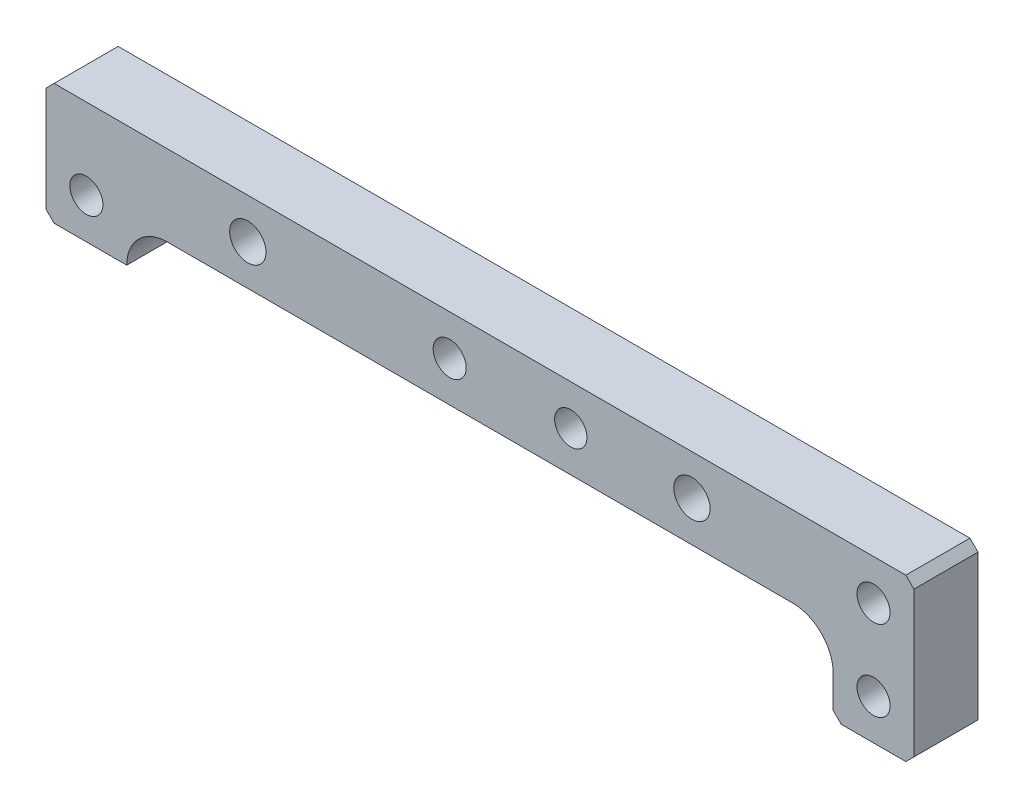
ISO-10303-21;
HEADER;
FILE_DESCRIPTION(('STEP AP214'),'2;1');
FILE_NAME('part.step','',(''),(''),'','','');
FILE_SCHEMA(('AUTOMOTIVE_DESIGN { 1 0 10303 214 1 1 1 1 }'));
ENDSEC;
DATA;
#1=APPLICATION_CONTEXT('core data for automotive mechanical design processes');
#2=APPLICATION_PROTOCOL_DEFINITION('international standard','automotive_design',2000,#1);
#3=PRODUCT_CONTEXT('',#1,'mechanical');
#4=PRODUCT('Part','Part','',(#3));
#5=PRODUCT_RELATED_PRODUCT_CATEGORY('part','',(#4));
#6=PRODUCT_DEFINITION_FORMATION('','',#4);
#7=PRODUCT_DEFINITION_CONTEXT('part definition',#1,'design');
#8=PRODUCT_DEFINITION('design','',#6,#7);
#9=PRODUCT_DEFINITION_SHAPE('','',#8);
#10=(LENGTH_UNIT() NAMED_UNIT(*) SI_UNIT(.MILLI.,.METRE.));
#11=(NAMED_UNIT(*) PLANE_ANGLE_UNIT() SI_UNIT($,.RADIAN.));
#12=(NAMED_UNIT(*) SI_UNIT($,.STERADIAN.) SOLID_ANGLE_UNIT());
#13=UNCERTAINTY_MEASURE_WITH_UNIT(LENGTH_MEASURE(1.E-05),#10,'distance_accuracy_value','');
#14=(GEOMETRIC_REPRESENTATION_CONTEXT(3) GLOBAL_UNCERTAINTY_ASSIGNED_CONTEXT((#13)) GLOBAL_UNIT_ASSIGNED_CONTEXT((#10,
#11,#12)) REPRESENTATION_CONTEXT('',''));
#15=CARTESIAN_POINT('',(0.,0.,0.));
#16=DIRECTION('',(0.,0.,1.));
#17=DIRECTION('',(1.,0.,0.));
#18=AXIS2_PLACEMENT_3D('',#15,#16,#17);
#19=CARTESIAN_POINT('',(0.,0.,15.875));
#20=DIRECTION('',(0.,0.,-1.));
#21=DIRECTION('',(-1.,0.,0.));
#22=AXIS2_PLACEMENT_3D('',#19,#20,#21);
#23=PLANE('',#22);
#24=CARTESIAN_POINT('',(-80.,0.,15.875));
#25=DIRECTION('',(0.,0.,-1.));
#26=DIRECTION('',(-1.,0.,0.));
#27=AXIS2_PLACEMENT_3D('',#24,#25,#26);
#28=CIRCLE('',#27,4.5);
#29=CARTESIAN_POINT('',(-84.5,0.,15.875));
#30=VERTEX_POINT('',#29);
#31=EDGE_CURVE('E375',#30,#30,#28,.T.);
#32=ORIENTED_EDGE('',*,*,#31,.T.);
#33=EDGE_LOOP('',(#32));
#34=FACE_BOUND('',#33,.T.);
#35=CARTESIAN_POINT('',(30.,0.,15.875));
#36=DIRECTION('',(0.,0.,-1.));
#37=DIRECTION('',(-1.,0.,0.));
#38=AXIS2_PLACEMENT_3D('',#35,#36,#37);
#39=CIRCLE('',#38,4.5);
#40=CARTESIAN_POINT('',(25.5,0.,15.875));
#41=VERTEX_POINT('',#40);
#42=EDGE_CURVE('E367',#41,#41,#39,.T.);
#43=ORIENTED_EDGE('',*,*,#42,.T.);
#44=EDGE_LOOP('',(#43));
#45=FACE_BOUND('',#44,.T.);
#46=DIRECTION('',(-1.,0.,0.));
#47=VECTOR('',#46,1.);
#48=CARTESIAN_POINT('',(0.,10.,15.875));
#49=LINE('',#48,#47);
#50=CARTESIAN_POINT('',(82.9999999999999,10.,15.875));
#51=VERTEX_POINT('',#50);
#52=CARTESIAN_POINT('',(-128.,9.99999999999994,15.875));
#53=VERTEX_POINT('',#52);
#54=EDGE_CURVE('E166',#51,#53,#49,.T.);
#55=ORIENTED_EDGE('',*,*,#54,.T.);
#56=DIRECTION('',(0.707106781186552,0.707106781186543,0.));
#57=VECTOR('',#56,1.);
#58=CARTESIAN_POINT('',(-130.,8.,15.875));
#59=LINE('',#58,#57);
#60=CARTESIAN_POINT('',(-130.,8.,15.875));
#61=VERTEX_POINT('',#60);
#62=EDGE_CURVE('E204',#53,#61,#59,.F.);
#63=ORIENTED_EDGE('',*,*,#62,.T.);
#64=DIRECTION('',(0.,-1.,0.));
#65=VECTOR('',#64,1.);
#66=CARTESIAN_POINT('',(-130.,10.,15.875));
#67=LINE('',#66,#65);
#68=CARTESIAN_POINT('',(-130.,-18.,15.875));
#69=VERTEX_POINT('',#68);
#70=EDGE_CURVE('E156',#61,#69,#67,.T.);
#71=ORIENTED_EDGE('',*,*,#70,.T.);
#72=DIRECTION('',(-0.707106781186552,0.707106781186543,0.));
#73=VECTOR('',#72,1.);
#74=CARTESIAN_POINT('',(-128.,-20.,15.875));
#75=LINE('',#74,#73);
#76=CARTESIAN_POINT('',(-128.,-20.,15.875));
#77=VERTEX_POINT('',#76);
#78=EDGE_CURVE('E151',#69,#77,#75,.F.);
#79=ORIENTED_EDGE('',*,*,#78,.T.);
#80=DIRECTION('',(1.,0.,0.));
#81=VECTOR('',#80,1.);
#82=CARTESIAN_POINT('',(-110.,-20.,15.875));
#83=LINE('',#82,#81);
#84=CARTESIAN_POINT('',(-110.,-20.,15.875));
#85=VERTEX_POINT('',#84);
#86=EDGE_CURVE('E141',#77,#85,#83,.T.);
#87=ORIENTED_EDGE('',*,*,#86,.T.);
#88=CARTESIAN_POINT('',(-100.,-20.,15.875));
#89=DIRECTION('',(0.,0.,-1.));
#90=DIRECTION('',(-1.,0.,0.));
#91=AXIS2_PLACEMENT_3D('',#88,#89,#90);
#92=CIRCLE('',#91,10.);
#93=CARTESIAN_POINT('',(-100.,-10.,15.875));
#94=VERTEX_POINT('',#93);
#95=EDGE_CURVE('E147',#85,#94,#92,.T.);
#96=ORIENTED_EDGE('',*,*,#95,.T.);
#97=DIRECTION('',(1.,0.,0.));
#98=VECTOR('',#97,1.);
#99=CARTESIAN_POINT('',(0.,-10.,15.875));
#100=LINE('',#99,#98);
#101=CARTESIAN_POINT('',(55.,-10.,15.875));
#102=VERTEX_POINT('',#101);
#103=EDGE_CURVE('E155',#94,#102,#100,.T.);
#104=ORIENTED_EDGE('',*,*,#103,.T.);
#105=CARTESIAN_POINT('',(55.,-20.,15.875));
#106=DIRECTION('',(0.,0.,-1.));
#107=DIRECTION('',(-1.,0.,0.));
#108=AXIS2_PLACEMENT_3D('',#105,#106,#107);
#109=CIRCLE('',#108,10.);
#110=CARTESIAN_POINT('',(65.,-20.,15.875));
#111=VERTEX_POINT('',#110);
#112=EDGE_CURVE('E177',#102,#111,#109,.T.);
#113=ORIENTED_EDGE('',*,*,#112,.T.);
#114=DIRECTION('',(0.,-1.,0.));
#115=VECTOR('',#114,1.);
#116=CARTESIAN_POINT('',(65.,-30.,15.875));
#117=LINE('',#116,#115);
#118=CARTESIAN_POINT('',(65.,-28.,15.875));
#119=VERTEX_POINT('',#118);
#120=EDGE_CURVE('E221',#111,#119,#117,.T.);
#121=ORIENTED_EDGE('',*,*,#120,.T.);
#122=DIRECTION('',(-0.707106781186543,0.707106781186552,0.));
#123=VECTOR('',#122,1.);
#124=CARTESIAN_POINT('',(66.9999999999999,-30.,15.875));
#125=LINE('',#124,#123);
#126=CARTESIAN_POINT('',(66.9999999999999,-30.,15.875));
#127=VERTEX_POINT('',#126);
#128=EDGE_CURVE('E201',#119,#127,#125,.F.);
#129=ORIENTED_EDGE('',*,*,#128,.T.);
#130=DIRECTION('',(1.,0.,0.));
#131=VECTOR('',#130,1.);
#132=CARTESIAN_POINT('',(85.,-30.,15.875));
#133=LINE('',#132,#131);
#134=CARTESIAN_POINT('',(83.,-30.,15.875));
#135=VERTEX_POINT('',#134);
#136=EDGE_CURVE('E229',#127,#135,#133,.T.);
#137=ORIENTED_EDGE('',*,*,#136,.T.);
#138=DIRECTION('',(-0.707106781186552,-0.707106781186543,0.));
#139=VECTOR('',#138,1.);
#140=CARTESIAN_POINT('',(85.,-28.,15.875));
#141=LINE('',#140,#139);
#142=CARTESIAN_POINT('',(85.,-28.,15.875));
#143=VERTEX_POINT('',#142);
#144=EDGE_CURVE('E62',#135,#143,#141,.F.);
#145=ORIENTED_EDGE('',*,*,#144,.T.);
#146=DIRECTION('',(0.,1.,0.));
#147=VECTOR('',#146,1.);
#148=CARTESIAN_POINT('',(85.,10.,15.875));
#149=LINE('',#148,#147);
#150=CARTESIAN_POINT('',(85.,8.,15.875));
#151=VERTEX_POINT('',#150);
#152=EDGE_CURVE('E327',#143,#151,#149,.T.);
#153=ORIENTED_EDGE('',*,*,#152,.T.);
#154=DIRECTION('',(0.707106781186548,-0.707106781186548,0.));
#155=VECTOR('',#154,1.);
#156=CARTESIAN_POINT('',(82.9999999999999,10.,15.875));
#157=LINE('',#156,#155);
#158=EDGE_CURVE('E198',#151,#51,#157,.F.);
#159=ORIENTED_EDGE('',*,*,#158,.T.);
#160=EDGE_LOOP('',(#55,#63,#71,#79,#87,#96,#104,#113,#121,#129,#137,#145,#153,#159));
#161=FACE_BOUND('',#160,.T.);
#162=CARTESIAN_POINT('',(0.,0.,15.875));
#163=DIRECTION('',(0.,0.,1.));
#164=DIRECTION('',(1.,0.,0.));
#165=AXIS2_PLACEMENT_3D('',#162,#163,#164);
#166=CIRCLE('',#165,4.);
#167=CARTESIAN_POINT('',(4.,0.,15.875));
#168=VERTEX_POINT('',#167);
#169=EDGE_CURVE('E336',#168,#168,#166,.T.);
#170=ORIENTED_EDGE('',*,*,#169,.F.);
#171=EDGE_LOOP('',(#170));
#172=FACE_BOUND('',#171,.T.);
#173=CARTESIAN_POINT('',(-30.,0.,15.875));
#174=DIRECTION('',(0.,0.,1.));
#175=DIRECTION('',(1.,0.,0.));
#176=AXIS2_PLACEMENT_3D('',#173,#174,#175);
#177=CIRCLE('',#176,4.1);
#178=CARTESIAN_POINT('',(-25.9,0.,15.875));
#179=VERTEX_POINT('',#178);
#180=EDGE_CURVE('E343',#179,#179,#177,.T.);
#181=ORIENTED_EDGE('',*,*,#180,.F.);
#182=EDGE_LOOP('',(#181));
#183=FACE_BOUND('',#182,.T.);
#184=CARTESIAN_POINT('',(-120.,-10.,15.875));
#185=DIRECTION('',(0.,0.,1.));
#186=DIRECTION('',(1.,0.,0.));
#187=AXIS2_PLACEMENT_3D('',#184,#185,#186);
#188=CIRCLE('',#187,4.09999999999999);
#189=CARTESIAN_POINT('',(-115.9,-10.,15.875));
#190=VERTEX_POINT('',#189);
#191=EDGE_CURVE('E349',#190,#190,#188,.T.);
#192=ORIENTED_EDGE('',*,*,#191,.F.);
#193=EDGE_LOOP('',(#192));
#194=FACE_BOUND('',#193,.T.);
#195=CARTESIAN_POINT('',(75.,0.,15.875));
#196=DIRECTION('',(0.,0.,1.));
#197=DIRECTION('',(1.,0.,0.));
#198=AXIS2_PLACEMENT_3D('',#195,#196,#197);
#199=CIRCLE('',#198,4.1);
#200=CARTESIAN_POINT('',(79.1,0.,15.875));
#201=VERTEX_POINT('',#200);
#202=EDGE_CURVE('E355',#201,#201,#199,.T.);
#203=ORIENTED_EDGE('',*,*,#202,.F.);
#204=EDGE_LOOP('',(#203));
#205=FACE_BOUND('',#204,.T.);
#206=CARTESIAN_POINT('',(75.,-20.,15.875));
#207=DIRECTION('',(0.,0.,1.));
#208=DIRECTION('',(1.,0.,0.));
#209=AXIS2_PLACEMENT_3D('',#206,#207,#208);
#210=CIRCLE('',#209,4.1);
#211=CARTESIAN_POINT('',(79.1,-20.,15.875));
#212=VERTEX_POINT('',#211);
#213=EDGE_CURVE('E361',#212,#212,#210,.T.);
#214=ORIENTED_EDGE('',*,*,#213,.F.);
#215=EDGE_LOOP('',(#214));
#216=FACE_BOUND('',#215,.T.);
#217=ADVANCED_FACE('F40',(#34,#45,#161,#172,#183,#194,#205,#216),#23,.F.);
#218=CARTESIAN_POINT('',(0.,0.,0.));
#219=DIRECTION('',(0.,0.,-1.));
#220=DIRECTION('',(-1.,0.,0.));
#221=AXIS2_PLACEMENT_3D('',#218,#219,#220);
#222=PLANE('',#221);
#223=CARTESIAN_POINT('',(-80.,0.,0.));
#224=DIRECTION('',(0.,0.,-1.));
#225=DIRECTION('',(-1.,0.,0.));
#226=AXIS2_PLACEMENT_3D('',#223,#224,#225);
#227=CIRCLE('',#226,4.5);
#228=CARTESIAN_POINT('',(-84.5,0.,0.));
#229=VERTEX_POINT('',#228);
#230=EDGE_CURVE('E377',#229,#229,#227,.T.);
#231=ORIENTED_EDGE('',*,*,#230,.F.);
#232=EDGE_LOOP('',(#231));
#233=FACE_BOUND('',#232,.T.);
#234=CARTESIAN_POINT('',(30.,0.,0.));
#235=DIRECTION('',(0.,0.,-1.));
#236=DIRECTION('',(-1.,0.,0.));
#237=AXIS2_PLACEMENT_3D('',#234,#235,#236);
#238=CIRCLE('',#237,4.5);
#239=CARTESIAN_POINT('',(25.5,0.,0.));
#240=VERTEX_POINT('',#239);
#241=EDGE_CURVE('E372',#240,#240,#238,.T.);
#242=ORIENTED_EDGE('',*,*,#241,.F.);
#243=EDGE_LOOP('',(#242));
#244=FACE_BOUND('',#243,.T.);
#245=CARTESIAN_POINT('',(75.,0.,0.));
#246=DIRECTION('',(0.,0.,1.));
#247=DIRECTION('',(1.,0.,0.));
#248=AXIS2_PLACEMENT_3D('',#245,#246,#247);
#249=CIRCLE('',#248,4.1);
#250=CARTESIAN_POINT('',(79.1,0.,0.));
#251=VERTEX_POINT('',#250);
#252=EDGE_CURVE('E358',#251,#251,#249,.T.);
#253=ORIENTED_EDGE('',*,*,#252,.T.);
#254=EDGE_LOOP('',(#253));
#255=FACE_BOUND('',#254,.T.);
#256=CARTESIAN_POINT('',(-30.,0.,0.));
#257=DIRECTION('',(0.,0.,1.));
#258=DIRECTION('',(1.,0.,0.));
#259=AXIS2_PLACEMENT_3D('',#256,#257,#258);
#260=CIRCLE('',#259,4.1);
#261=CARTESIAN_POINT('',(-25.9,0.,0.));
#262=VERTEX_POINT('',#261);
#263=EDGE_CURVE('E346',#262,#262,#260,.T.);
#264=ORIENTED_EDGE('',*,*,#263,.T.);
#265=EDGE_LOOP('',(#264));
#266=FACE_BOUND('',#265,.T.);
#267=DIRECTION('',(0.,-1.,0.));
#268=VECTOR('',#267,1.);
#269=CARTESIAN_POINT('',(-130.,10.,0.));
#270=LINE('',#269,#268);
#271=CARTESIAN_POINT('',(-130.,8.,0.));
#272=VERTEX_POINT('',#271);
#273=CARTESIAN_POINT('',(-130.,-18.,0.));
#274=VERTEX_POINT('',#273);
#275=EDGE_CURVE('E321',#272,#274,#270,.T.);
#276=ORIENTED_EDGE('',*,*,#275,.F.);
#277=DIRECTION('',(-0.707106781186552,-0.707106781186543,0.));
#278=VECTOR('',#277,1.);
#279=CARTESIAN_POINT('',(-68.9999999999991,69.0000000000001,0.));
#280=LINE('',#279,#278);
#281=CARTESIAN_POINT('',(-128.,10.,0.));
#282=VERTEX_POINT('',#281);
#283=EDGE_CURVE('E191',#272,#282,#280,.F.);
#284=ORIENTED_EDGE('',*,*,#283,.T.);
#285=DIRECTION('',(-1.,0.,0.));
#286=VECTOR('',#285,1.);
#287=CARTESIAN_POINT('',(0.,10.,0.));
#288=LINE('',#287,#286);
#289=CARTESIAN_POINT('',(82.9999999999999,10.,0.));
#290=VERTEX_POINT('',#289);
#291=EDGE_CURVE('E246',#290,#282,#288,.T.);
#292=ORIENTED_EDGE('',*,*,#291,.F.);
#293=DIRECTION('',(-0.707106781186548,0.707106781186548,0.));
#294=VECTOR('',#293,1.);
#295=CARTESIAN_POINT('',(46.5,46.5,0.));
#296=LINE('',#295,#294);
#297=CARTESIAN_POINT('',(85.,8.,0.));
#298=VERTEX_POINT('',#297);
#299=EDGE_CURVE('E183',#290,#298,#296,.F.);
#300=ORIENTED_EDGE('',*,*,#299,.T.);
#301=DIRECTION('',(0.,1.,0.));
#302=VECTOR('',#301,1.);
#303=CARTESIAN_POINT('',(85.,10.,0.));
#304=LINE('',#303,#302);
#305=CARTESIAN_POINT('',(85.,-28.,0.));
#306=VERTEX_POINT('',#305);
#307=EDGE_CURVE('E244',#306,#298,#304,.T.);
#308=ORIENTED_EDGE('',*,*,#307,.F.);
#309=DIRECTION('',(0.707106781186552,0.707106781186543,0.));
#310=VECTOR('',#309,1.);
#311=CARTESIAN_POINT('',(56.4999999999994,-56.5000000000002,0.));
#312=LINE('',#311,#310);
#313=CARTESIAN_POINT('',(83.,-30.,0.));
#314=VERTEX_POINT('',#313);
#315=EDGE_CURVE('E185',#306,#314,#312,.F.);
#316=ORIENTED_EDGE('',*,*,#315,.T.);
#317=DIRECTION('',(1.,0.,0.));
#318=VECTOR('',#317,1.);
#319=CARTESIAN_POINT('',(85.,-30.,0.));
#320=LINE('',#319,#318);
#321=CARTESIAN_POINT('',(66.9999999999999,-30.,0.));
#322=VERTEX_POINT('',#321);
#323=EDGE_CURVE('E237',#322,#314,#320,.T.);
#324=ORIENTED_EDGE('',*,*,#323,.F.);
#325=DIRECTION('',(0.707106781186543,-0.707106781186552,0.));
#326=VECTOR('',#325,1.);
#327=CARTESIAN_POINT('',(18.5000000000004,18.5000000000002,0.));
#328=LINE('',#327,#326);
#329=CARTESIAN_POINT('',(65.,-28.,0.));
#330=VERTEX_POINT('',#329);
#331=EDGE_CURVE('E187',#322,#330,#328,.F.);
#332=ORIENTED_EDGE('',*,*,#331,.T.);
#333=DIRECTION('',(0.,-1.,0.));
#334=VECTOR('',#333,1.);
#335=CARTESIAN_POINT('',(65.,-30.,0.));
#336=LINE('',#335,#334);
#337=CARTESIAN_POINT('',(65.,-20.,0.));
#338=VERTEX_POINT('',#337);
#339=EDGE_CURVE('E224',#338,#330,#336,.T.);
#340=ORIENTED_EDGE('',*,*,#339,.F.);
#341=CARTESIAN_POINT('',(55.,-20.,0.));
#342=DIRECTION('',(0.,0.,-1.));
#343=DIRECTION('',(-1.,0.,0.));
#344=AXIS2_PLACEMENT_3D('',#341,#342,#343);
#345=CIRCLE('',#344,10.);
#346=CARTESIAN_POINT('',(55.,-10.,0.));
#347=VERTEX_POINT('',#346);
#348=EDGE_CURVE('E258',#338,#347,#345,.F.);
#349=ORIENTED_EDGE('',*,*,#348,.T.);
#350=DIRECTION('',(1.,0.,0.));
#351=VECTOR('',#350,1.);
#352=CARTESIAN_POINT('',(65.,-10.,0.));
#353=LINE('',#352,#351);
#354=CARTESIAN_POINT('',(-100.,-9.99999999999999,0.));
#355=VERTEX_POINT('',#354);
#356=EDGE_CURVE('E248',#355,#347,#353,.T.);
#357=ORIENTED_EDGE('',*,*,#356,.F.);
#358=CARTESIAN_POINT('',(-100.,-20.,0.));
#359=DIRECTION('',(0.,0.,-1.));
#360=DIRECTION('',(-1.,0.,0.));
#361=AXIS2_PLACEMENT_3D('',#358,#359,#360);
#362=CIRCLE('',#361,10.);
#363=CARTESIAN_POINT('',(-110.,-20.,0.));
#364=VERTEX_POINT('',#363);
#365=EDGE_CURVE('E173',#355,#364,#362,.F.);
#366=ORIENTED_EDGE('',*,*,#365,.T.);
#367=DIRECTION('',(1.,0.,0.));
#368=VECTOR('',#367,1.);
#369=CARTESIAN_POINT('',(-110.,-20.,0.));
#370=LINE('',#369,#368);
#371=CARTESIAN_POINT('',(-128.,-20.,0.));
#372=VERTEX_POINT('',#371);
#373=EDGE_CURVE('E162',#372,#364,#370,.T.);
#374=ORIENTED_EDGE('',*,*,#373,.F.);
#375=DIRECTION('',(0.707106781186552,-0.707106781186543,0.));
#376=VECTOR('',#375,1.);
#377=CARTESIAN_POINT('',(-73.9999999999991,-74.0000000000001,0.));
#378=LINE('',#377,#376);
#379=EDGE_CURVE('E189',#372,#274,#378,.F.);
#380=ORIENTED_EDGE('',*,*,#379,.T.);
#381=EDGE_LOOP('',(#276,#284,#292,#300,#308,#316,#324,#332,#340,#349,#357,#366,#374,#380));
#382=FACE_BOUND('',#381,.T.);
#383=CARTESIAN_POINT('',(0.,0.,0.));
#384=DIRECTION('',(0.,0.,1.));
#385=DIRECTION('',(1.,0.,0.));
#386=AXIS2_PLACEMENT_3D('',#383,#384,#385);
#387=CIRCLE('',#386,4.);
#388=CARTESIAN_POINT('',(4.,0.,0.));
#389=VERTEX_POINT('',#388);
#390=EDGE_CURVE('E338',#389,#389,#387,.T.);
#391=ORIENTED_EDGE('',*,*,#390,.T.);
#392=EDGE_LOOP('',(#391));
#393=FACE_BOUND('',#392,.T.);
#394=CARTESIAN_POINT('',(-120.,-10.,0.));
#395=DIRECTION('',(0.,0.,1.));
#396=DIRECTION('',(1.,0.,0.));
#397=AXIS2_PLACEMENT_3D('',#394,#395,#396);
#398=CIRCLE('',#397,4.09999999999999);
#399=CARTESIAN_POINT('',(-115.9,-10.,0.));
#400=VERTEX_POINT('',#399);
#401=EDGE_CURVE('E352',#400,#400,#398,.T.);
#402=ORIENTED_EDGE('',*,*,#401,.T.);
#403=EDGE_LOOP('',(#402));
#404=FACE_BOUND('',#403,.T.);
#405=CARTESIAN_POINT('',(75.,-20.,0.));
#406=DIRECTION('',(0.,0.,1.));
#407=DIRECTION('',(1.,0.,0.));
#408=AXIS2_PLACEMENT_3D('',#405,#406,#407);
#409=CIRCLE('',#408,4.1);
#410=CARTESIAN_POINT('',(79.1,-20.,0.));
#411=VERTEX_POINT('',#410);
#412=EDGE_CURVE('E364',#411,#411,#409,.T.);
#413=ORIENTED_EDGE('',*,*,#412,.T.);
#414=EDGE_LOOP('',(#413));
#415=FACE_BOUND('',#414,.T.);
#416=ADVANCED_FACE('F241',(#233,#244,#255,#266,#382,#393,#404,#415),#222,.T.);
#417=CARTESIAN_POINT('',(-130.,10.,15.875));
#418=DIRECTION('',(1.,0.,0.));
#419=DIRECTION('',(0.,0.,-1.));
#420=AXIS2_PLACEMENT_3D('',#417,#418,#419);
#421=PLANE('',#420);
#422=ORIENTED_EDGE('',*,*,#70,.F.);
#423=DIRECTION('',(0.,0.,-1.));
#424=VECTOR('',#423,1.);
#425=CARTESIAN_POINT('',(-130.,8.,15.875));
#426=LINE('',#425,#424);
#427=EDGE_CURVE('E175',#61,#272,#426,.T.);
#428=ORIENTED_EDGE('',*,*,#427,.T.);
#429=ORIENTED_EDGE('',*,*,#275,.T.);
#430=DIRECTION('',(0.,0.,1.));
#431=VECTOR('',#430,1.);
#432=CARTESIAN_POINT('',(-130.,-18.,15.875));
#433=LINE('',#432,#431);
#434=EDGE_CURVE('E172',#274,#69,#433,.T.);
#435=ORIENTED_EDGE('',*,*,#434,.T.);
#436=EDGE_LOOP('',(#422,#428,#429,#435));
#437=FACE_BOUND('',#436,.T.);
#438=ADVANCED_FACE('F285',(#437),#421,.F.);
#439=CARTESIAN_POINT('',(-110.,-20.,15.875));
#440=DIRECTION('',(0.,1.,0.));
#441=DIRECTION('',(0.,0.,1.));
#442=AXIS2_PLACEMENT_3D('',#439,#440,#441);
#443=PLANE('',#442);
#444=ORIENTED_EDGE('',*,*,#86,.F.);
#445=DIRECTION('',(0.,0.,-1.));
#446=VECTOR('',#445,1.);
#447=CARTESIAN_POINT('',(-128.,-20.,15.875));
#448=LINE('',#447,#446);
#449=EDGE_CURVE('E206',#77,#372,#448,.T.);
#450=ORIENTED_EDGE('',*,*,#449,.T.);
#451=ORIENTED_EDGE('',*,*,#373,.T.);
#452=DIRECTION('',(0.,0.,-1.));
#453=VECTOR('',#452,1.);
#454=CARTESIAN_POINT('',(-110.,-20.,15.875));
#455=LINE('',#454,#453);
#456=EDGE_CURVE('E159',#85,#364,#455,.T.);
#457=ORIENTED_EDGE('',*,*,#456,.F.);
#458=EDGE_LOOP('',(#444,#450,#451,#457));
#459=FACE_BOUND('',#458,.T.);
#460=ADVANCED_FACE('F160',(#459),#443,.F.);
#461=CARTESIAN_POINT('',(65.,-10.,15.875));
#462=DIRECTION('',(0.,1.,0.));
#463=DIRECTION('',(-1.,0.,0.));
#464=AXIS2_PLACEMENT_3D('',#461,#462,#463);
#465=PLANE('',#464);
#466=ORIENTED_EDGE('',*,*,#356,.T.);
#467=DIRECTION('',(0.,0.,-1.));
#468=VECTOR('',#467,1.);
#469=CARTESIAN_POINT('',(55.,-10.,15.875));
#470=LINE('',#469,#468);
#471=EDGE_CURVE('E256',#347,#102,#470,.F.);
#472=ORIENTED_EDGE('',*,*,#471,.T.);
#473=ORIENTED_EDGE('',*,*,#103,.F.);
#474=DIRECTION('',(0.,0.,-1.));
#475=VECTOR('',#474,1.);
#476=CARTESIAN_POINT('',(-100.,-9.99999999999999,0.));
#477=LINE('',#476,#475);
#478=EDGE_CURVE('E171',#94,#355,#477,.T.);
#479=ORIENTED_EDGE('',*,*,#478,.T.);
#480=EDGE_LOOP('',(#466,#472,#473,#479));
#481=FACE_BOUND('',#480,.T.);
#482=ADVANCED_FACE('F264',(#481),#465,.F.);
#483=CARTESIAN_POINT('',(65.,-30.,15.875));
#484=DIRECTION('',(1.,0.,0.));
#485=DIRECTION('',(0.,0.,-1.));
#486=AXIS2_PLACEMENT_3D('',#483,#484,#485);
#487=PLANE('',#486);
#488=ORIENTED_EDGE('',*,*,#339,.T.);
#489=DIRECTION('',(0.,0.,1.));
#490=VECTOR('',#489,1.);
#491=CARTESIAN_POINT('',(65.,-28.,15.875));
#492=LINE('',#491,#490);
#493=EDGE_CURVE('E213',#330,#119,#492,.T.);
#494=ORIENTED_EDGE('',*,*,#493,.T.);
#495=ORIENTED_EDGE('',*,*,#120,.F.);
#496=DIRECTION('',(0.,0.,-1.));
#497=VECTOR('',#496,1.);
#498=CARTESIAN_POINT('',(65.,-20.,0.));
#499=LINE('',#498,#497);
#500=EDGE_CURVE('E165',#111,#338,#499,.T.);
#501=ORIENTED_EDGE('',*,*,#500,.T.);
#502=EDGE_LOOP('',(#488,#494,#495,#501));
#503=FACE_BOUND('',#502,.T.);
#504=ADVANCED_FACE('F219',(#503),#487,.F.);
#505=CARTESIAN_POINT('',(85.,-30.,15.875));
#506=DIRECTION('',(0.,1.,0.));
#507=DIRECTION('',(-1.,0.,0.));
#508=AXIS2_PLACEMENT_3D('',#505,#506,#507);
#509=PLANE('',#508);
#510=ORIENTED_EDGE('',*,*,#136,.F.);
#511=DIRECTION('',(0.,0.,-1.));
#512=VECTOR('',#511,1.);
#513=CARTESIAN_POINT('',(66.9999999999999,-30.,15.875));
#514=LINE('',#513,#512);
#515=EDGE_CURVE('E210',#127,#322,#514,.T.);
#516=ORIENTED_EDGE('',*,*,#515,.T.);
#517=ORIENTED_EDGE('',*,*,#323,.T.);
#518=DIRECTION('',(0.,0.,1.));
#519=VECTOR('',#518,1.);
#520=CARTESIAN_POINT('',(83.,-30.,15.875));
#521=LINE('',#520,#519);
#522=EDGE_CURVE('E208',#314,#135,#521,.T.);
#523=ORIENTED_EDGE('',*,*,#522,.T.);
#524=EDGE_LOOP('',(#510,#516,#517,#523));
#525=FACE_BOUND('',#524,.T.);
#526=ADVANCED_FACE('F236',(#525),#509,.F.);
#527=CARTESIAN_POINT('',(85.,10.,15.875));
#528=DIRECTION('',(-1.,0.,0.));
#529=DIRECTION('',(0.,-1.,0.));
#530=AXIS2_PLACEMENT_3D('',#527,#528,#529);
#531=PLANE('',#530);
#532=ORIENTED_EDGE('',*,*,#152,.F.);
#533=DIRECTION('',(0.,0.,-1.));
#534=VECTOR('',#533,1.);
#535=CARTESIAN_POINT('',(85.,-28.,15.875));
#536=LINE('',#535,#534);
#537=EDGE_CURVE('E11',#143,#306,#536,.T.);
#538=ORIENTED_EDGE('',*,*,#537,.T.);
#539=ORIENTED_EDGE('',*,*,#307,.T.);
#540=DIRECTION('',(0.,0.,1.));
#541=VECTOR('',#540,1.);
#542=CARTESIAN_POINT('',(85.,8.,15.875));
#543=LINE('',#542,#541);
#544=EDGE_CURVE('E49',#298,#151,#543,.T.);
#545=ORIENTED_EDGE('',*,*,#544,.T.);
#546=EDGE_LOOP('',(#532,#538,#539,#545));
#547=FACE_BOUND('',#546,.T.);
#548=ADVANCED_FACE('F297',(#547),#531,.F.);
#549=CARTESIAN_POINT('',(0.,10.,15.875));
#550=DIRECTION('',(0.,-1.,0.));
#551=DIRECTION('',(0.,0.,-1.));
#552=AXIS2_PLACEMENT_3D('',#549,#550,#551);
#553=PLANE('',#552);
#554=ORIENTED_EDGE('',*,*,#291,.T.);
#555=DIRECTION('',(0.,0.,1.));
#556=VECTOR('',#555,1.);
#557=CARTESIAN_POINT('',(-128.,10.,15.875));
#558=LINE('',#557,#556);
#559=EDGE_CURVE('E196',#282,#53,#558,.T.);
#560=ORIENTED_EDGE('',*,*,#559,.T.);
#561=ORIENTED_EDGE('',*,*,#54,.F.);
#562=DIRECTION('',(0.,0.,-1.));
#563=VECTOR('',#562,1.);
#564=CARTESIAN_POINT('',(82.9999999999999,10.,15.875));
#565=LINE('',#564,#563);
#566=EDGE_CURVE('E193',#51,#290,#565,.T.);
#567=ORIENTED_EDGE('',*,*,#566,.T.);
#568=EDGE_LOOP('',(#554,#560,#561,#567));
#569=FACE_BOUND('',#568,.T.);
#570=ADVANCED_FACE('F294',(#569),#553,.F.);
#571=CARTESIAN_POINT('',(0.,0.,15.875));
#572=DIRECTION('',(0.,0.,-1.));
#573=DIRECTION('',(-1.,0.,0.));
#574=AXIS2_PLACEMENT_3D('',#571,#572,#573);
#575=CYLINDRICAL_SURFACE('',#574,4.);
#576=ORIENTED_EDGE('',*,*,#169,.T.);
#577=EDGE_LOOP('',(#576));
#578=FACE_BOUND('',#577,.T.);
#579=ORIENTED_EDGE('',*,*,#390,.F.);
#580=EDGE_LOOP('',(#579));
#581=FACE_BOUND('',#580,.T.);
#582=ADVANCED_FACE('F291',(#578,#581),#575,.F.);
#583=CARTESIAN_POINT('',(-30.,0.,15.875));
#584=DIRECTION('',(0.,0.,-1.));
#585=DIRECTION('',(-1.,0.,0.));
#586=AXIS2_PLACEMENT_3D('',#583,#584,#585);
#587=CYLINDRICAL_SURFACE('',#586,4.1);
#588=ORIENTED_EDGE('',*,*,#180,.T.);
#589=EDGE_LOOP('',(#588));
#590=FACE_BOUND('',#589,.T.);
#591=ORIENTED_EDGE('',*,*,#263,.F.);
#592=EDGE_LOOP('',(#591));
#593=FACE_BOUND('',#592,.T.);
#594=ADVANCED_FACE('F390',(#590,#593),#587,.F.);
#595=CARTESIAN_POINT('',(-120.,-10.,15.875));
#596=DIRECTION('',(0.,0.,-1.));
#597=DIRECTION('',(-1.,0.,0.));
#598=AXIS2_PLACEMENT_3D('',#595,#596,#597);
#599=CYLINDRICAL_SURFACE('',#598,4.09999999999999);
#600=ORIENTED_EDGE('',*,*,#191,.T.);
#601=EDGE_LOOP('',(#600));
#602=FACE_BOUND('',#601,.T.);
#603=ORIENTED_EDGE('',*,*,#401,.F.);
#604=EDGE_LOOP('',(#603));
#605=FACE_BOUND('',#604,.T.);
#606=ADVANCED_FACE('F392',(#602,#605),#599,.F.);
#607=CARTESIAN_POINT('',(75.,0.,15.875));
#608=DIRECTION('',(0.,0.,-1.));
#609=DIRECTION('',(-1.,0.,0.));
#610=AXIS2_PLACEMENT_3D('',#607,#608,#609);
#611=CYLINDRICAL_SURFACE('',#610,4.1);
#612=ORIENTED_EDGE('',*,*,#202,.T.);
#613=EDGE_LOOP('',(#612));
#614=FACE_BOUND('',#613,.T.);
#615=ORIENTED_EDGE('',*,*,#252,.F.);
#616=EDGE_LOOP('',(#615));
#617=FACE_BOUND('',#616,.T.);
#618=ADVANCED_FACE('F275',(#614,#617),#611,.F.);
#619=CARTESIAN_POINT('',(75.,-20.,15.875));
#620=DIRECTION('',(0.,0.,-1.));
#621=DIRECTION('',(-1.,0.,0.));
#622=AXIS2_PLACEMENT_3D('',#619,#620,#621);
#623=CYLINDRICAL_SURFACE('',#622,4.1);
#624=ORIENTED_EDGE('',*,*,#213,.T.);
#625=EDGE_LOOP('',(#624));
#626=FACE_BOUND('',#625,.T.);
#627=ORIENTED_EDGE('',*,*,#412,.F.);
#628=EDGE_LOOP('',(#627));
#629=FACE_BOUND('',#628,.T.);
#630=ADVANCED_FACE('F267',(#626,#629),#623,.F.);
#631=CARTESIAN_POINT('',(55.,-20.,15.875));
#632=DIRECTION('',(0.,0.,1.));
#633=DIRECTION('',(1.,0.,0.));
#634=AXIS2_PLACEMENT_3D('',#631,#632,#633);
#635=CYLINDRICAL_SURFACE('',#634,10.);
#636=ORIENTED_EDGE('',*,*,#112,.F.);
#637=ORIENTED_EDGE('',*,*,#471,.F.);
#638=ORIENTED_EDGE('',*,*,#348,.F.);
#639=ORIENTED_EDGE('',*,*,#500,.F.);
#640=EDGE_LOOP('',(#636,#637,#638,#639));
#641=FACE_BOUND('',#640,.T.);
#642=ADVANCED_FACE('F265',(#641),#635,.F.);
#643=CARTESIAN_POINT('',(-100.,-20.,15.875));
#644=DIRECTION('',(0.,0.,1.));
#645=DIRECTION('',(1.,0.,0.));
#646=AXIS2_PLACEMENT_3D('',#643,#644,#645);
#647=CYLINDRICAL_SURFACE('',#646,10.);
#648=ORIENTED_EDGE('',*,*,#95,.F.);
#649=ORIENTED_EDGE('',*,*,#456,.T.);
#650=ORIENTED_EDGE('',*,*,#365,.F.);
#651=ORIENTED_EDGE('',*,*,#478,.F.);
#652=EDGE_LOOP('',(#648,#649,#650,#651));
#653=FACE_BOUND('',#652,.T.);
#654=ADVANCED_FACE('F169',(#653),#647,.F.);
#655=CARTESIAN_POINT('',(-130.,8.,15.875));
#656=DIRECTION('',(0.707106781186542,-0.707106781186552,0.));
#657=DIRECTION('',(0.,0.,-1.));
#658=AXIS2_PLACEMENT_3D('',#655,#656,#657);
#659=PLANE('',#658);
#660=ORIENTED_EDGE('',*,*,#62,.F.);
#661=ORIENTED_EDGE('',*,*,#559,.F.);
#662=ORIENTED_EDGE('',*,*,#283,.F.);
#663=ORIENTED_EDGE('',*,*,#427,.F.);
#664=EDGE_LOOP('',(#660,#661,#662,#663));
#665=FACE_BOUND('',#664,.T.);
#666=ADVANCED_FACE('F273',(#665),#659,.F.);
#667=CARTESIAN_POINT('',(-128.,-20.,15.875));
#668=DIRECTION('',(0.707106781186542,0.707106781186552,0.));
#669=DIRECTION('',(0.,0.,-1.));
#670=AXIS2_PLACEMENT_3D('',#667,#668,#669);
#671=PLANE('',#670);
#672=ORIENTED_EDGE('',*,*,#78,.F.);
#673=ORIENTED_EDGE('',*,*,#434,.F.);
#674=ORIENTED_EDGE('',*,*,#379,.F.);
#675=ORIENTED_EDGE('',*,*,#449,.F.);
#676=EDGE_LOOP('',(#672,#673,#674,#675));
#677=FACE_BOUND('',#676,.T.);
#678=ADVANCED_FACE('F432',(#677),#671,.F.);
#679=CARTESIAN_POINT('',(66.9999999999999,-30.,15.875));
#680=DIRECTION('',(0.707106781186552,0.707106781186543,0.));
#681=DIRECTION('',(0.,0.,-1.));
#682=AXIS2_PLACEMENT_3D('',#679,#680,#681);
#683=PLANE('',#682);
#684=ORIENTED_EDGE('',*,*,#128,.F.);
#685=ORIENTED_EDGE('',*,*,#493,.F.);
#686=ORIENTED_EDGE('',*,*,#331,.F.);
#687=ORIENTED_EDGE('',*,*,#515,.F.);
#688=EDGE_LOOP('',(#684,#685,#686,#687));
#689=FACE_BOUND('',#688,.T.);
#690=ADVANCED_FACE('F232',(#689),#683,.F.);
#691=CARTESIAN_POINT('',(85.,-28.,15.875));
#692=DIRECTION('',(-0.707106781186543,0.707106781186552,0.));
#693=DIRECTION('',(0.,0.,-1.));
#694=AXIS2_PLACEMENT_3D('',#691,#692,#693);
#695=PLANE('',#694);
#696=ORIENTED_EDGE('',*,*,#144,.F.);
#697=ORIENTED_EDGE('',*,*,#522,.F.);
#698=ORIENTED_EDGE('',*,*,#315,.F.);
#699=ORIENTED_EDGE('',*,*,#537,.F.);
#700=EDGE_LOOP('',(#696,#697,#698,#699));
#701=FACE_BOUND('',#700,.T.);
#702=ADVANCED_FACE('F329',(#701),#695,.F.);
#703=CARTESIAN_POINT('',(82.9999999999999,10.,15.875));
#704=DIRECTION('',(-0.707106781186547,-0.707106781186547,0.));
#705=DIRECTION('',(0.,0.,-1.));
#706=AXIS2_PLACEMENT_3D('',#703,#704,#705);
#707=PLANE('',#706);
#708=ORIENTED_EDGE('',*,*,#158,.F.);
#709=ORIENTED_EDGE('',*,*,#544,.F.);
#710=ORIENTED_EDGE('',*,*,#299,.F.);
#711=ORIENTED_EDGE('',*,*,#566,.F.);
#712=EDGE_LOOP('',(#708,#709,#710,#711));
#713=FACE_BOUND('',#712,.T.);
#714=ADVANCED_FACE('F43',(#713),#707,.F.);
#715=CARTESIAN_POINT('',(30.,0.,20.));
#716=DIRECTION('',(0.,0.,-1.));
#717=DIRECTION('',(-1.,0.,0.));
#718=AXIS2_PLACEMENT_3D('',#715,#716,#717);
#719=CYLINDRICAL_SURFACE('',#718,4.5);
#720=ORIENTED_EDGE('',*,*,#241,.T.);
#721=EDGE_LOOP('',(#720));
#722=FACE_BOUND('',#721,.T.);
#723=ORIENTED_EDGE('',*,*,#42,.F.);
#724=EDGE_LOOP('',(#723));
#725=FACE_BOUND('',#724,.T.);
#726=ADVANCED_FACE('F404',(#722,#725),#719,.F.);
#727=CARTESIAN_POINT('',(-80.,0.,20.));
#728=DIRECTION('',(0.,0.,-1.));
#729=DIRECTION('',(-1.,0.,0.));
#730=AXIS2_PLACEMENT_3D('',#727,#728,#729);
#731=CYLINDRICAL_SURFACE('',#730,4.5);
#732=ORIENTED_EDGE('',*,*,#230,.T.);
#733=EDGE_LOOP('',(#732));
#734=FACE_BOUND('',#733,.T.);
#735=ORIENTED_EDGE('',*,*,#31,.F.);
#736=EDGE_LOOP('',(#735));
#737=FACE_BOUND('',#736,.T.);
#738=ADVANCED_FACE('F381',(#734,#737),#731,.F.);
#739=CLOSED_SHELL('',(#217,#416,#438,#460,#482,#504,#526,#548,#570,#582,#594,#606,#618,#630,
#642,#654,#666,#678,#690,#702,#714,#726,#738));
#740=MANIFOLD_SOLID_BREP('B2',#739);
#741=ADVANCED_BREP_SHAPE_REPRESENTATION('',(#18,#740),#14);
#742=SHAPE_DEFINITION_REPRESENTATION(#9,#741);
ENDSEC;
END-ISO-10303-21;
